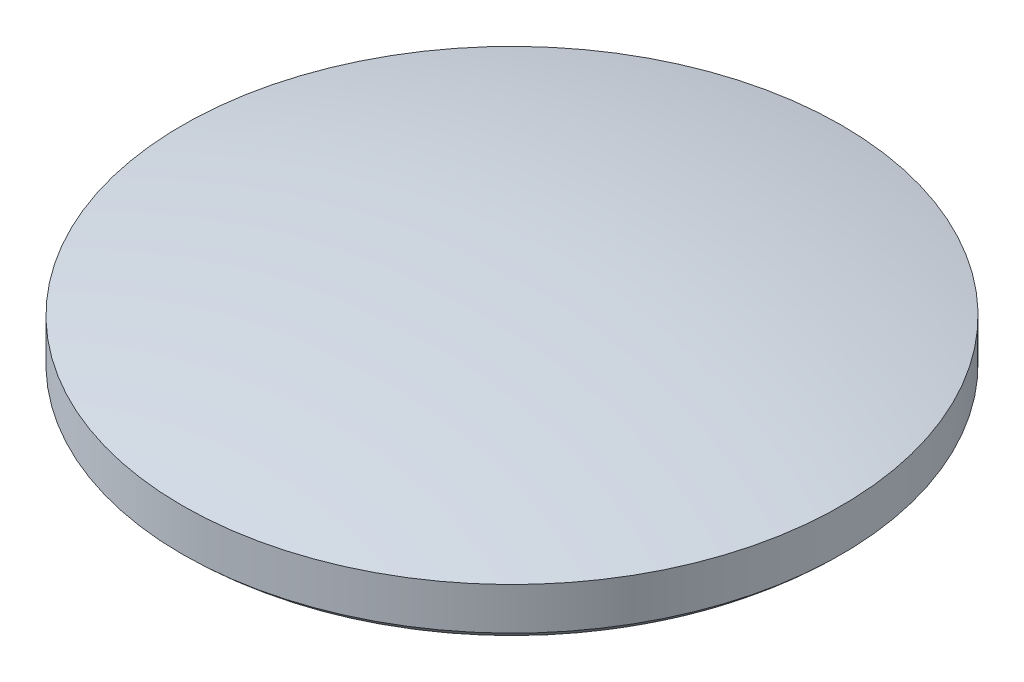
ISO-10303-21;
HEADER;
FILE_DESCRIPTION(('STEP AP214'),'2;1');
FILE_NAME('part.step','',(''),(''),'','','');
FILE_SCHEMA(('AUTOMOTIVE_DESIGN { 1 0 10303 214 1 1 1 1 }'));
ENDSEC;
DATA;
#1=APPLICATION_CONTEXT('core data for automotive mechanical design processes');
#2=APPLICATION_PROTOCOL_DEFINITION('international standard','automotive_design',2000,#1);
#3=PRODUCT_CONTEXT('',#1,'mechanical');
#4=PRODUCT('Part','Part','',(#3));
#5=PRODUCT_RELATED_PRODUCT_CATEGORY('part','',(#4));
#6=PRODUCT_DEFINITION_FORMATION('','',#4);
#7=PRODUCT_DEFINITION_CONTEXT('part definition',#1,'design');
#8=PRODUCT_DEFINITION('design','',#6,#7);
#9=PRODUCT_DEFINITION_SHAPE('','',#8);
#10=(LENGTH_UNIT() NAMED_UNIT(*) SI_UNIT(.MILLI.,.METRE.));
#11=(NAMED_UNIT(*) PLANE_ANGLE_UNIT() SI_UNIT($,.RADIAN.));
#12=(NAMED_UNIT(*) SI_UNIT($,.STERADIAN.) SOLID_ANGLE_UNIT());
#13=UNCERTAINTY_MEASURE_WITH_UNIT(LENGTH_MEASURE(1.E-05),#10,'distance_accuracy_value','');
#14=(GEOMETRIC_REPRESENTATION_CONTEXT(3) GLOBAL_UNCERTAINTY_ASSIGNED_CONTEXT((#13)) GLOBAL_UNIT_ASSIGNED_CONTEXT((#10,
#11,#12)) REPRESENTATION_CONTEXT('',''));
#15=CARTESIAN_POINT('',(0.,0.,0.));
#16=DIRECTION('',(0.,0.,1.));
#17=DIRECTION('',(1.,0.,0.));
#18=AXIS2_PLACEMENT_3D('',#15,#16,#17);
#19=CARTESIAN_POINT('',(0.,7.01460340476938,0.));
#20=DIRECTION('',(0.,1.,0.));
#21=DIRECTION('',(0.,0.,1.));
#22=AXIS2_PLACEMENT_3D('',#19,#20,#21);
#23=TOROIDAL_SURFACE('',#22,16.5743027122209,9.84143142777625);
#24=CARTESIAN_POINT('',(0.,0.,0.));
#25=DIRECTION('',(0.,1.,0.));
#26=DIRECTION('',(0.,0.,1.));
#27=AXIS2_PLACEMENT_3D('',#24,#25,#26);
#28=CIRCLE('',#27,23.4771363058561);
#29=CARTESIAN_POINT('',(0.,0.,23.4771363058561));
#30=VERTEX_POINT('',#29);
#31=EDGE_CURVE('E52',#30,#30,#28,.T.);
#32=ORIENTED_EDGE('',*,*,#31,.F.);
#33=EDGE_LOOP('',(#32));
#34=FACE_BOUND('',#33,.T.);
#35=CARTESIAN_POINT('',(0.,-1.20768895166634,0.));
#36=DIRECTION('',(0.,1.,0.));
#37=DIRECTION('',(0.,0.,1.));
#38=AXIS2_PLACEMENT_3D('',#35,#36,#37);
#39=CIRCLE('',#38,21.9824152251888);
#40=CARTESIAN_POINT('',(0.,-1.20768895166634,21.9824152251888));
#41=VERTEX_POINT('',#40);
#42=EDGE_CURVE('E11',#41,#41,#39,.T.);
#43=ORIENTED_EDGE('',*,*,#42,.T.);
#44=EDGE_LOOP('',(#43));
#45=FACE_BOUND('',#44,.T.);
#46=ADVANCED_FACE('F34',(#34,#45),#23,.T.);
#47=CARTESIAN_POINT('',(21.9824152251888,-1.20768895166634,0.));
#48=DIRECTION('',(0.,1.,0.));
#49=DIRECTION('',(0.,0.,1.));
#50=AXIS2_PLACEMENT_3D('',#47,#48,#49);
#51=PLANE('',#50);
#52=ORIENTED_EDGE('',*,*,#42,.F.);
#53=EDGE_LOOP('',(#52));
#54=FACE_BOUND('',#53,.T.);
#55=ADVANCED_FACE('F47',(#54),#51,.F.);
#56=CARTESIAN_POINT('',(0.,-91.9389137547891,0.324091097718192));
#57=DIRECTION('',(-1.,0.,0.));
#58=DIRECTION('',(0.,0.,1.));
#59=AXIS2_PLACEMENT_3D('',#56,#57,#58);
#60=CIRCLE('',#59,97.7213428445872);
#61=TRIMMED_CURVE('',#60,(PARAMETER_VALUE(-1.5741128151116)),(PARAMETER_VALUE(1.5741128151116)),
.T.,.PARAMETER.);
#62=CARTESIAN_POINT('',(0.,-91.9389137547891,0.));
#63=DIRECTION('',(0.,1.,0.));
#64=AXIS1_PLACEMENT('',#62,#63);
#65=SURFACE_OF_REVOLUTION('',#61,#64);
#66=CARTESIAN_POINT('',(0.,5.78189166713598,0.));
#67=VERTEX_POINT('',#66);
#68=VERTEX_LOOP('',#67);
#69=FACE_BOUND('',#68,.T.);
#70=CARTESIAN_POINT('',(0.,3.,0.));
#71=DIRECTION('',(0.,1.,0.));
#72=DIRECTION('',(0.,0.,1.));
#73=AXIS2_PLACEMENT_3D('',#70,#71,#72);
#74=CIRCLE('',#73,23.4771363058561);
#75=CARTESIAN_POINT('',(0.,3.,23.4771363058561));
#76=VERTEX_POINT('',#75);
#77=EDGE_CURVE('E40',#76,#76,#74,.T.);
#78=ORIENTED_EDGE('',*,*,#77,.T.);
#79=EDGE_LOOP('',(#78));
#80=FACE_BOUND('',#79,.T.);
#81=ADVANCED_FACE('F43',(#69,#80),#65,.T.);
#82=CARTESIAN_POINT('',(0.,8.93123536900466,0.));
#83=DIRECTION('',(0.,1.,0.));
#84=DIRECTION('',(0.,0.,1.));
#85=AXIS2_PLACEMENT_3D('',#82,#83,#84);
#86=CYLINDRICAL_SURFACE('',#85,23.4771363058561);
#87=ORIENTED_EDGE('',*,*,#77,.F.);
#88=EDGE_LOOP('',(#87));
#89=FACE_BOUND('',#88,.T.);
#90=ORIENTED_EDGE('',*,*,#31,.T.);
#91=EDGE_LOOP('',(#90));
#92=FACE_BOUND('',#91,.T.);
#93=ADVANCED_FACE('F46',(#89,#92),#86,.T.);
#94=CLOSED_SHELL('',(#46,#55,#81,#93));
#95=MANIFOLD_SOLID_BREP('B2',#94);
#96=ADVANCED_BREP_SHAPE_REPRESENTATION('',(#18,#95),#14);
#97=SHAPE_DEFINITION_REPRESENTATION(#9,#96);
ENDSEC;
END-ISO-10303-21;
